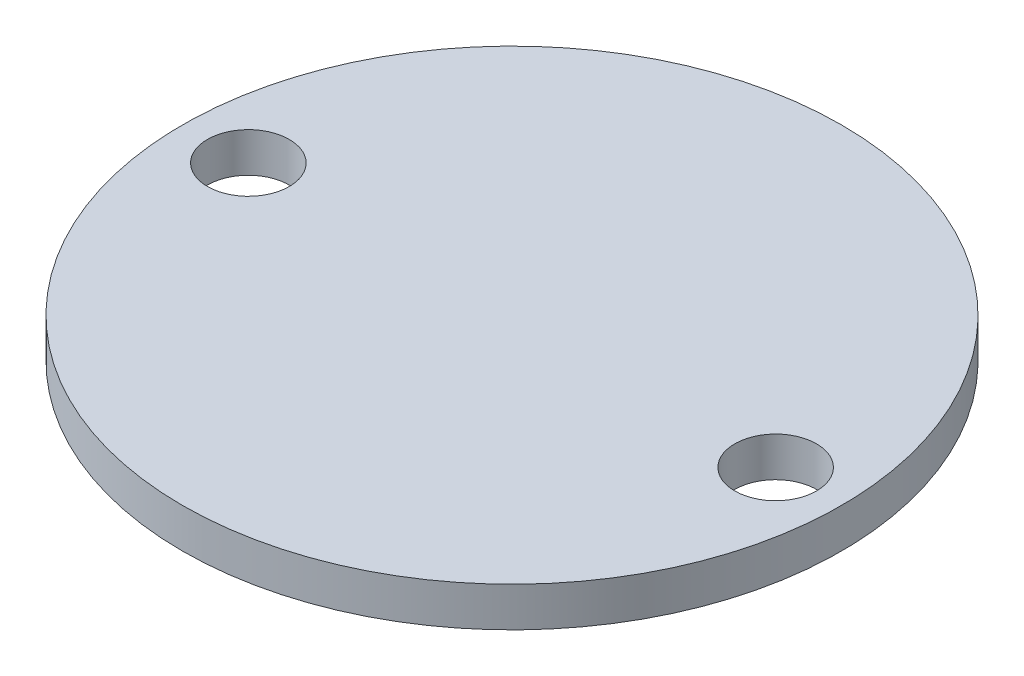
ISO-10303-21;
HEADER;
FILE_DESCRIPTION(('STEP AP214'),'2;1');
FILE_NAME('part.step','',(''),(''),'','','');
FILE_SCHEMA(('AUTOMOTIVE_DESIGN { 1 0 10303 214 1 1 1 1 }'));
ENDSEC;
DATA;
#1=APPLICATION_CONTEXT('core data for automotive mechanical design processes');
#2=APPLICATION_PROTOCOL_DEFINITION('international standard','automotive_design',2000,#1);
#3=PRODUCT_CONTEXT('',#1,'mechanical');
#4=PRODUCT('Part','Part','',(#3));
#5=PRODUCT_RELATED_PRODUCT_CATEGORY('part','',(#4));
#6=PRODUCT_DEFINITION_FORMATION('','',#4);
#7=PRODUCT_DEFINITION_CONTEXT('part definition',#1,'design');
#8=PRODUCT_DEFINITION('design','',#6,#7);
#9=PRODUCT_DEFINITION_SHAPE('','',#8);
#10=(LENGTH_UNIT() NAMED_UNIT(*) SI_UNIT(.MILLI.,.METRE.));
#11=(NAMED_UNIT(*) PLANE_ANGLE_UNIT() SI_UNIT($,.RADIAN.));
#12=(NAMED_UNIT(*) SI_UNIT($,.STERADIAN.) SOLID_ANGLE_UNIT());
#13=UNCERTAINTY_MEASURE_WITH_UNIT(LENGTH_MEASURE(1.E-05),#10,'distance_accuracy_value','');
#14=(GEOMETRIC_REPRESENTATION_CONTEXT(3) GLOBAL_UNCERTAINTY_ASSIGNED_CONTEXT((#13)) GLOBAL_UNIT_ASSIGNED_CONTEXT((#10,
#11,#12)) REPRESENTATION_CONTEXT('',''));
#15=CARTESIAN_POINT('',(0.,0.,0.));
#16=DIRECTION('',(0.,0.,1.));
#17=DIRECTION('',(1.,0.,0.));
#18=AXIS2_PLACEMENT_3D('',#15,#16,#17);
#19=CARTESIAN_POINT('',(0.,1.5,0.));
#20=DIRECTION('',(0.,-1.,0.));
#21=DIRECTION('',(0.,0.,-1.));
#22=AXIS2_PLACEMENT_3D('',#19,#20,#21);
#23=CYLINDRICAL_SURFACE('',#22,12.5);
#24=CARTESIAN_POINT('',(0.,1.5,0.));
#25=DIRECTION('',(0.,1.,0.));
#26=DIRECTION('',(0.,0.,1.));
#27=AXIS2_PLACEMENT_3D('',#24,#25,#26);
#28=CIRCLE('',#27,12.5);
#29=CARTESIAN_POINT('',(0.,1.5,12.5));
#30=VERTEX_POINT('',#29);
#31=EDGE_CURVE('E10',#30,#30,#28,.T.);
#32=ORIENTED_EDGE('',*,*,#31,.F.);
#33=EDGE_LOOP('',(#32));
#34=FACE_BOUND('',#33,.T.);
#35=CARTESIAN_POINT('',(0.,0.,0.));
#36=DIRECTION('',(0.,1.,0.));
#37=DIRECTION('',(0.,0.,1.));
#38=AXIS2_PLACEMENT_3D('',#35,#36,#37);
#39=CIRCLE('',#38,12.5);
#40=CARTESIAN_POINT('',(0.,0.,12.5));
#41=VERTEX_POINT('',#40);
#42=EDGE_CURVE('E35',#41,#41,#39,.T.);
#43=ORIENTED_EDGE('',*,*,#42,.T.);
#44=EDGE_LOOP('',(#43));
#45=FACE_BOUND('',#44,.T.);
#46=ADVANCED_FACE('F32',(#34,#45),#23,.T.);
#47=CARTESIAN_POINT('',(0.,1.5,0.));
#48=DIRECTION('',(0.,1.,0.));
#49=DIRECTION('',(0.,0.,1.));
#50=AXIS2_PLACEMENT_3D('',#47,#48,#49);
#51=PLANE('',#50);
#52=CARTESIAN_POINT('',(10.,1.5,0.));
#53=DIRECTION('',(0.,1.,0.));
#54=DIRECTION('',(0.,0.,1.));
#55=AXIS2_PLACEMENT_3D('',#52,#53,#54);
#56=CIRCLE('',#55,1.55);
#57=CARTESIAN_POINT('',(10.,1.5,1.55));
#58=VERTEX_POINT('',#57);
#59=EDGE_CURVE('E50',#58,#58,#56,.T.);
#60=ORIENTED_EDGE('',*,*,#59,.F.);
#61=EDGE_LOOP('',(#60));
#62=FACE_BOUND('',#61,.T.);
#63=CARTESIAN_POINT('',(-10.,1.5,0.));
#64=DIRECTION('',(0.,1.,0.));
#65=DIRECTION('',(0.,0.,1.));
#66=AXIS2_PLACEMENT_3D('',#63,#64,#65);
#67=CIRCLE('',#66,1.55);
#68=CARTESIAN_POINT('',(-10.,1.5,1.55));
#69=VERTEX_POINT('',#68);
#70=EDGE_CURVE('E44',#69,#69,#67,.T.);
#71=ORIENTED_EDGE('',*,*,#70,.F.);
#72=EDGE_LOOP('',(#71));
#73=FACE_BOUND('',#72,.T.);
#74=ORIENTED_EDGE('',*,*,#31,.T.);
#75=EDGE_LOOP('',(#74));
#76=FACE_BOUND('',#75,.T.);
#77=ADVANCED_FACE('F66',(#62,#73,#76),#51,.T.);
#78=CARTESIAN_POINT('',(0.,0.,0.));
#79=DIRECTION('',(0.,1.,0.));
#80=DIRECTION('',(0.,0.,1.));
#81=AXIS2_PLACEMENT_3D('',#78,#79,#80);
#82=PLANE('',#81);
#83=CARTESIAN_POINT('',(10.,0.,0.));
#84=DIRECTION('',(0.,1.,0.));
#85=DIRECTION('',(0.,0.,1.));
#86=AXIS2_PLACEMENT_3D('',#83,#84,#85);
#87=CIRCLE('',#86,1.55);
#88=CARTESIAN_POINT('',(10.,0.,1.55));
#89=VERTEX_POINT('',#88);
#90=EDGE_CURVE('E42',#89,#89,#87,.T.);
#91=ORIENTED_EDGE('',*,*,#90,.T.);
#92=EDGE_LOOP('',(#91));
#93=FACE_BOUND('',#92,.T.);
#94=CARTESIAN_POINT('',(-10.,0.,0.));
#95=DIRECTION('',(0.,1.,0.));
#96=DIRECTION('',(0.,0.,1.));
#97=AXIS2_PLACEMENT_3D('',#94,#95,#96);
#98=CIRCLE('',#97,1.55);
#99=CARTESIAN_POINT('',(-10.,0.,1.55));
#100=VERTEX_POINT('',#99);
#101=EDGE_CURVE('E47',#100,#100,#98,.T.);
#102=ORIENTED_EDGE('',*,*,#101,.T.);
#103=EDGE_LOOP('',(#102));
#104=FACE_BOUND('',#103,.T.);
#105=ORIENTED_EDGE('',*,*,#42,.F.);
#106=EDGE_LOOP('',(#105));
#107=FACE_BOUND('',#106,.T.);
#108=ADVANCED_FACE('F56',(#93,#104,#107),#82,.F.);
#109=CARTESIAN_POINT('',(-10.,0.,0.));
#110=DIRECTION('',(0.,1.,0.));
#111=DIRECTION('',(0.,0.,1.));
#112=AXIS2_PLACEMENT_3D('',#109,#110,#111);
#113=CYLINDRICAL_SURFACE('',#112,1.55);
#114=ORIENTED_EDGE('',*,*,#101,.F.);
#115=EDGE_LOOP('',(#114));
#116=FACE_BOUND('',#115,.T.);
#117=ORIENTED_EDGE('',*,*,#70,.T.);
#118=EDGE_LOOP('',(#117));
#119=FACE_BOUND('',#118,.T.);
#120=ADVANCED_FACE('F62',(#116,#119),#113,.F.);
#121=CARTESIAN_POINT('',(10.,0.,0.));
#122=DIRECTION('',(0.,1.,0.));
#123=DIRECTION('',(0.,0.,1.));
#124=AXIS2_PLACEMENT_3D('',#121,#122,#123);
#125=CYLINDRICAL_SURFACE('',#124,1.55);
#126=ORIENTED_EDGE('',*,*,#90,.F.);
#127=EDGE_LOOP('',(#126));
#128=FACE_BOUND('',#127,.T.);
#129=ORIENTED_EDGE('',*,*,#59,.T.);
#130=EDGE_LOOP('',(#129));
#131=FACE_BOUND('',#130,.T.);
#132=ADVANCED_FACE('F59',(#128,#131),#125,.F.);
#133=CLOSED_SHELL('',(#46,#77,#108,#120,#132));
#134=MANIFOLD_SOLID_BREP('B2',#133);
#135=ADVANCED_BREP_SHAPE_REPRESENTATION('',(#18,#134),#14);
#136=SHAPE_DEFINITION_REPRESENTATION(#9,#135);
ENDSEC;
END-ISO-10303-21;
